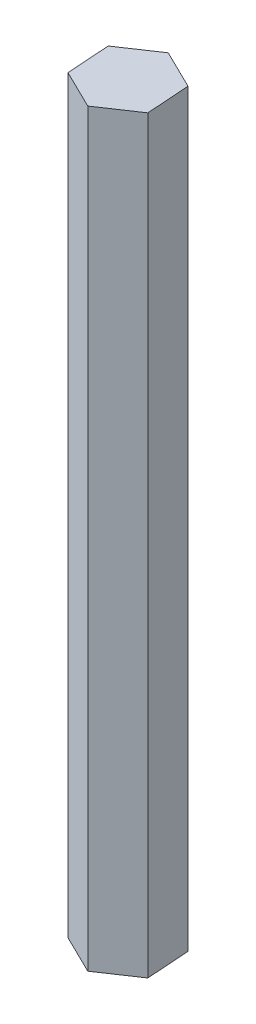
ISO-10303-21;
HEADER;
FILE_DESCRIPTION(('STEP AP214'),'2;1');
FILE_NAME('part.step','',(''),(''),'','','');
FILE_SCHEMA(('AUTOMOTIVE_DESIGN { 1 0 10303 214 1 1 1 1 }'));
ENDSEC;
DATA;
#1=APPLICATION_CONTEXT('core data for automotive mechanical design processes');
#2=APPLICATION_PROTOCOL_DEFINITION('international standard','automotive_design',2000,#1);
#3=PRODUCT_CONTEXT('',#1,'mechanical');
#4=PRODUCT('Part','Part','',(#3));
#5=PRODUCT_RELATED_PRODUCT_CATEGORY('part','',(#4));
#6=PRODUCT_DEFINITION_FORMATION('','',#4);
#7=PRODUCT_DEFINITION_CONTEXT('part definition',#1,'design');
#8=PRODUCT_DEFINITION('design','',#6,#7);
#9=PRODUCT_DEFINITION_SHAPE('','',#8);
#10=(LENGTH_UNIT() NAMED_UNIT(*) SI_UNIT(.MILLI.,.METRE.));
#11=(NAMED_UNIT(*) PLANE_ANGLE_UNIT() SI_UNIT($,.RADIAN.));
#12=(NAMED_UNIT(*) SI_UNIT($,.STERADIAN.) SOLID_ANGLE_UNIT());
#13=UNCERTAINTY_MEASURE_WITH_UNIT(LENGTH_MEASURE(1.E-05),#10,'distance_accuracy_value','');
#14=(GEOMETRIC_REPRESENTATION_CONTEXT(3) GLOBAL_UNCERTAINTY_ASSIGNED_CONTEXT((#13)) GLOBAL_UNIT_ASSIGNED_CONTEXT((#10,
#11,#12)) REPRESENTATION_CONTEXT('',''));
#15=CARTESIAN_POINT('',(0.,0.,0.));
#16=DIRECTION('',(0.,0.,1.));
#17=DIRECTION('',(1.,0.,0.));
#18=AXIS2_PLACEMENT_3D('',#15,#16,#17);
#19=CARTESIAN_POINT('',(6.58391671442759,63.5,3.22728586134143));
#20=DIRECTION('',(-0.997699733294284,0.,0.0677882156758364));
#21=DIRECTION('',(0.0677882156758364,0.,0.997699733294285));
#22=AXIS2_PLACEMENT_3D('',#19,#20,#21);
#23=PLANE('',#22);
#24=DIRECTION('',(-0.0677882156758364,0.,-0.997699733294284));
#25=VECTOR('',#24,1.);
#26=CARTESIAN_POINT('',(6.58391671442759,-63.5,3.22728586134143));
#27=LINE('',#26,#25);
#28=CARTESIAN_POINT('',(6.58391671442759,-63.5,3.22728586134143));
#29=VERTEX_POINT('',#28);
#30=CARTESIAN_POINT('',(6.08686989840982,-63.5,-4.08819620042456));
#31=VERTEX_POINT('',#30);
#32=EDGE_CURVE('E117',#29,#31,#27,.T.);
#33=ORIENTED_EDGE('',*,*,#32,.T.);
#34=DIRECTION('',(0.,-1.,0.));
#35=VECTOR('',#34,1.);
#36=CARTESIAN_POINT('',(6.08686989840982,63.5,-4.08819620042456));
#37=LINE('',#36,#35);
#38=CARTESIAN_POINT('',(6.08686989840982,63.5,-4.08819620042456));
#39=VERTEX_POINT('',#38);
#40=EDGE_CURVE('E11',#39,#31,#37,.T.);
#41=ORIENTED_EDGE('',*,*,#40,.F.);
#42=DIRECTION('',(-0.0677882156758364,0.,-0.997699733294284));
#43=VECTOR('',#42,1.);
#44=CARTESIAN_POINT('',(6.58391671442759,63.5,3.22728586134143));
#45=LINE('',#44,#43);
#46=CARTESIAN_POINT('',(6.58391671442759,63.5,3.22728586134143));
#47=VERTEX_POINT('',#46);
#48=EDGE_CURVE('E127',#47,#39,#45,.T.);
#49=ORIENTED_EDGE('',*,*,#48,.F.);
#50=DIRECTION('',(0.,-1.,0.));
#51=VECTOR('',#50,1.);
#52=CARTESIAN_POINT('',(6.58391671442759,63.5,3.22728586134143));
#53=LINE('',#52,#51);
#54=EDGE_CURVE('E113',#47,#29,#53,.T.);
#55=ORIENTED_EDGE('',*,*,#54,.T.);
#56=EDGE_LOOP('',(#33,#41,#49,#55));
#57=FACE_BOUND('',#56,.T.);
#58=ADVANCED_FACE('F33',(#57),#23,.F.);
#59=CARTESIAN_POINT('',(6.08686989840982,63.5,-4.08819620042456));
#60=DIRECTION('',(-0.440143549794649,0.,0.897927422219728));
#61=DIRECTION('',(0.897927422219728,0.,0.440143549794649));
#62=AXIS2_PLACEMENT_3D('',#59,#60,#61);
#63=PLANE('',#62);
#64=DIRECTION('',(-0.897927422219728,0.,-0.440143549794649));
#65=VECTOR('',#64,1.);
#66=CARTESIAN_POINT('',(6.08686989840982,-63.5,-4.08819620042456));
#67=LINE('',#66,#65);
#68=CARTESIAN_POINT('',(-0.497046816017772,-63.5,-7.31548206176599));
#69=VERTEX_POINT('',#68);
#70=EDGE_CURVE('E120',#31,#69,#67,.T.);
#71=ORIENTED_EDGE('',*,*,#70,.T.);
#72=DIRECTION('',(0.,-1.,0.));
#73=VECTOR('',#72,1.);
#74=CARTESIAN_POINT('',(-0.497046816017772,63.5,-7.31548206176599));
#75=LINE('',#74,#73);
#76=CARTESIAN_POINT('',(-0.497046816017772,63.5,-7.31548206176599));
#77=VERTEX_POINT('',#76);
#78=EDGE_CURVE('E41',#77,#69,#75,.T.);
#79=ORIENTED_EDGE('',*,*,#78,.F.);
#80=DIRECTION('',(-0.897927422219728,0.,-0.440143549794649));
#81=VECTOR('',#80,1.);
#82=CARTESIAN_POINT('',(6.08686989840982,63.5,-4.08819620042456));
#83=LINE('',#82,#81);
#84=EDGE_CURVE('E86',#39,#77,#83,.T.);
#85=ORIENTED_EDGE('',*,*,#84,.F.);
#86=ORIENTED_EDGE('',*,*,#40,.T.);
#87=EDGE_LOOP('',(#71,#79,#85,#86));
#88=FACE_BOUND('',#87,.T.);
#89=ADVANCED_FACE('F151',(#88),#63,.F.);
#90=CARTESIAN_POINT('',(-0.497046816017772,63.5,-7.31548206176599));
#91=DIRECTION('',(0.557556183499635,0.,0.830139206543891));
#92=DIRECTION('',(0.830139206543891,0.,-0.557556183499635));
#93=AXIS2_PLACEMENT_3D('',#90,#91,#92);
#94=PLANE('',#93);
#95=DIRECTION('',(-0.830139206543891,0.,0.557556183499635));
#96=VECTOR('',#95,1.);
#97=CARTESIAN_POINT('',(-0.497046816017772,-63.5,-7.31548206176599));
#98=LINE('',#97,#96);
#99=CARTESIAN_POINT('',(-6.58391671442759,-63.5,-3.22728586134143));
#100=VERTEX_POINT('',#99);
#101=EDGE_CURVE('E122',#69,#100,#98,.T.);
#102=ORIENTED_EDGE('',*,*,#101,.T.);
#103=DIRECTION('',(0.,-1.,0.));
#104=VECTOR('',#103,1.);
#105=CARTESIAN_POINT('',(-6.58391671442759,63.5,-3.22728586134143));
#106=LINE('',#105,#104);
#107=CARTESIAN_POINT('',(-6.58391671442759,63.5,-3.22728586134143));
#108=VERTEX_POINT('',#107);
#109=EDGE_CURVE('E108',#108,#100,#106,.T.);
#110=ORIENTED_EDGE('',*,*,#109,.F.);
#111=DIRECTION('',(-0.830139206543891,0.,0.557556183499635));
#112=VECTOR('',#111,1.);
#113=CARTESIAN_POINT('',(-0.497046816017772,63.5,-7.31548206176599));
#114=LINE('',#113,#112);
#115=EDGE_CURVE('E99',#77,#108,#114,.T.);
#116=ORIENTED_EDGE('',*,*,#115,.F.);
#117=ORIENTED_EDGE('',*,*,#78,.T.);
#118=EDGE_LOOP('',(#102,#110,#116,#117));
#119=FACE_BOUND('',#118,.T.);
#120=ADVANCED_FACE('F133',(#119),#94,.F.);
#121=CARTESIAN_POINT('',(-6.58391671442759,63.5,-3.22728586134143));
#122=DIRECTION('',(0.997699733294284,0.,-0.0677882156758365));
#123=DIRECTION('',(-0.0677882156758365,0.,-0.997699733294285));
#124=AXIS2_PLACEMENT_3D('',#121,#122,#123);
#125=PLANE('',#124);
#126=DIRECTION('',(0.0677882156758365,0.,0.997699733294284));
#127=VECTOR('',#126,1.);
#128=CARTESIAN_POINT('',(-6.58391671442759,-63.5,-3.22728586134143));
#129=LINE('',#128,#127);
#130=CARTESIAN_POINT('',(-6.08686989840982,-63.5,4.08819620042456));
#131=VERTEX_POINT('',#130);
#132=EDGE_CURVE('E107',#100,#131,#129,.T.);
#133=ORIENTED_EDGE('',*,*,#132,.T.);
#134=DIRECTION('',(0.,-1.,0.));
#135=VECTOR('',#134,1.);
#136=CARTESIAN_POINT('',(-6.08686989840982,63.5,4.08819620042456));
#137=LINE('',#136,#135);
#138=CARTESIAN_POINT('',(-6.08686989840982,63.5,4.08819620042456));
#139=VERTEX_POINT('',#138);
#140=EDGE_CURVE('E104',#139,#131,#137,.T.);
#141=ORIENTED_EDGE('',*,*,#140,.F.);
#142=DIRECTION('',(0.0677882156758365,0.,0.997699733294284));
#143=VECTOR('',#142,1.);
#144=CARTESIAN_POINT('',(-6.58391671442759,63.5,-3.22728586134143));
#145=LINE('',#144,#143);
#146=EDGE_CURVE('E93',#108,#139,#145,.T.);
#147=ORIENTED_EDGE('',*,*,#146,.F.);
#148=ORIENTED_EDGE('',*,*,#109,.T.);
#149=EDGE_LOOP('',(#133,#141,#147,#148));
#150=FACE_BOUND('',#149,.T.);
#151=ADVANCED_FACE('F105',(#150),#125,.F.);
#152=CARTESIAN_POINT('',(-6.08686989840982,63.5,4.08819620042456));
#153=DIRECTION('',(0.440143549794649,0.,-0.897927422219728));
#154=DIRECTION('',(-0.897927422219728,0.,-0.440143549794649));
#155=AXIS2_PLACEMENT_3D('',#152,#153,#154);
#156=PLANE('',#155);
#157=DIRECTION('',(0.897927422219728,0.,0.440143549794649));
#158=VECTOR('',#157,1.);
#159=CARTESIAN_POINT('',(-6.08686989840982,-63.5,4.08819620042456));
#160=LINE('',#159,#158);
#161=CARTESIAN_POINT('',(0.497046816017774,-63.5,7.31548206176599));
#162=VERTEX_POINT('',#161);
#163=EDGE_CURVE('E72',#131,#162,#160,.T.);
#164=ORIENTED_EDGE('',*,*,#163,.T.);
#165=DIRECTION('',(0.,-1.,0.));
#166=VECTOR('',#165,1.);
#167=CARTESIAN_POINT('',(0.497046816017774,63.5,7.31548206176599));
#168=LINE('',#167,#166);
#169=CARTESIAN_POINT('',(0.497046816017774,63.5,7.31548206176599));
#170=VERTEX_POINT('',#169);
#171=EDGE_CURVE('E109',#170,#162,#168,.T.);
#172=ORIENTED_EDGE('',*,*,#171,.F.);
#173=DIRECTION('',(0.897927422219728,0.,0.440143549794649));
#174=VECTOR('',#173,1.);
#175=CARTESIAN_POINT('',(-6.08686989840982,63.5,4.08819620042456));
#176=LINE('',#175,#174);
#177=EDGE_CURVE('E97',#139,#170,#176,.T.);
#178=ORIENTED_EDGE('',*,*,#177,.F.);
#179=ORIENTED_EDGE('',*,*,#140,.T.);
#180=EDGE_LOOP('',(#164,#172,#178,#179));
#181=FACE_BOUND('',#180,.T.);
#182=ADVANCED_FACE('F111',(#181),#156,.F.);
#183=CARTESIAN_POINT('',(0.497046816017774,63.5,7.31548206176599));
#184=DIRECTION('',(-0.557556183499635,0.,-0.830139206543891));
#185=DIRECTION('',(-0.830139206543891,0.,0.557556183499635));
#186=AXIS2_PLACEMENT_3D('',#183,#184,#185);
#187=PLANE('',#186);
#188=DIRECTION('',(0.830139206543891,0.,-0.557556183499635));
#189=VECTOR('',#188,1.);
#190=CARTESIAN_POINT('',(0.497046816017774,-63.5,7.31548206176599));
#191=LINE('',#190,#189);
#192=EDGE_CURVE('E78',#162,#29,#191,.T.);
#193=ORIENTED_EDGE('',*,*,#192,.T.);
#194=ORIENTED_EDGE('',*,*,#54,.F.);
#195=DIRECTION('',(0.830139206543891,0.,-0.557556183499635));
#196=VECTOR('',#195,1.);
#197=CARTESIAN_POINT('',(0.497046816017774,63.5,7.31548206176599));
#198=LINE('',#197,#196);
#199=EDGE_CURVE('E49',#170,#47,#198,.T.);
#200=ORIENTED_EDGE('',*,*,#199,.F.);
#201=ORIENTED_EDGE('',*,*,#171,.T.);
#202=EDGE_LOOP('',(#193,#194,#200,#201));
#203=FACE_BOUND('',#202,.T.);
#204=ADVANCED_FACE('F140',(#203),#187,.F.);
#205=CARTESIAN_POINT('',(0.,63.5,0.));
#206=DIRECTION('',(0.,1.,0.));
#207=DIRECTION('',(0.,0.,1.));
#208=AXIS2_PLACEMENT_3D('',#205,#206,#207);
#209=PLANE('',#208);
#210=ORIENTED_EDGE('',*,*,#48,.T.);
#211=ORIENTED_EDGE('',*,*,#84,.T.);
#212=ORIENTED_EDGE('',*,*,#115,.T.);
#213=ORIENTED_EDGE('',*,*,#146,.T.);
#214=ORIENTED_EDGE('',*,*,#177,.T.);
#215=ORIENTED_EDGE('',*,*,#199,.T.);
#216=EDGE_LOOP('',(#210,#211,#212,#213,#214,#215));
#217=FACE_BOUND('',#216,.T.);
#218=ADVANCED_FACE('F95',(#217),#209,.T.);
#219=CARTESIAN_POINT('',(0.,-63.5,0.));
#220=DIRECTION('',(0.,1.,0.));
#221=DIRECTION('',(0.,0.,1.));
#222=AXIS2_PLACEMENT_3D('',#219,#220,#221);
#223=PLANE('',#222);
#224=ORIENTED_EDGE('',*,*,#32,.F.);
#225=ORIENTED_EDGE('',*,*,#192,.F.);
#226=ORIENTED_EDGE('',*,*,#163,.F.);
#227=ORIENTED_EDGE('',*,*,#132,.F.);
#228=ORIENTED_EDGE('',*,*,#101,.F.);
#229=ORIENTED_EDGE('',*,*,#70,.F.);
#230=EDGE_LOOP('',(#224,#225,#226,#227,#228,#229));
#231=FACE_BOUND('',#230,.T.);
#232=ADVANCED_FACE('F136',(#231),#223,.F.);
#233=CLOSED_SHELL('',(#58,#89,#120,#151,#182,#204,#218,#232));
#234=MANIFOLD_SOLID_BREP('B2',#233);
#235=ADVANCED_BREP_SHAPE_REPRESENTATION('',(#18,#234),#14);
#236=SHAPE_DEFINITION_REPRESENTATION(#9,#235);
ENDSEC;
END-ISO-10303-21;
